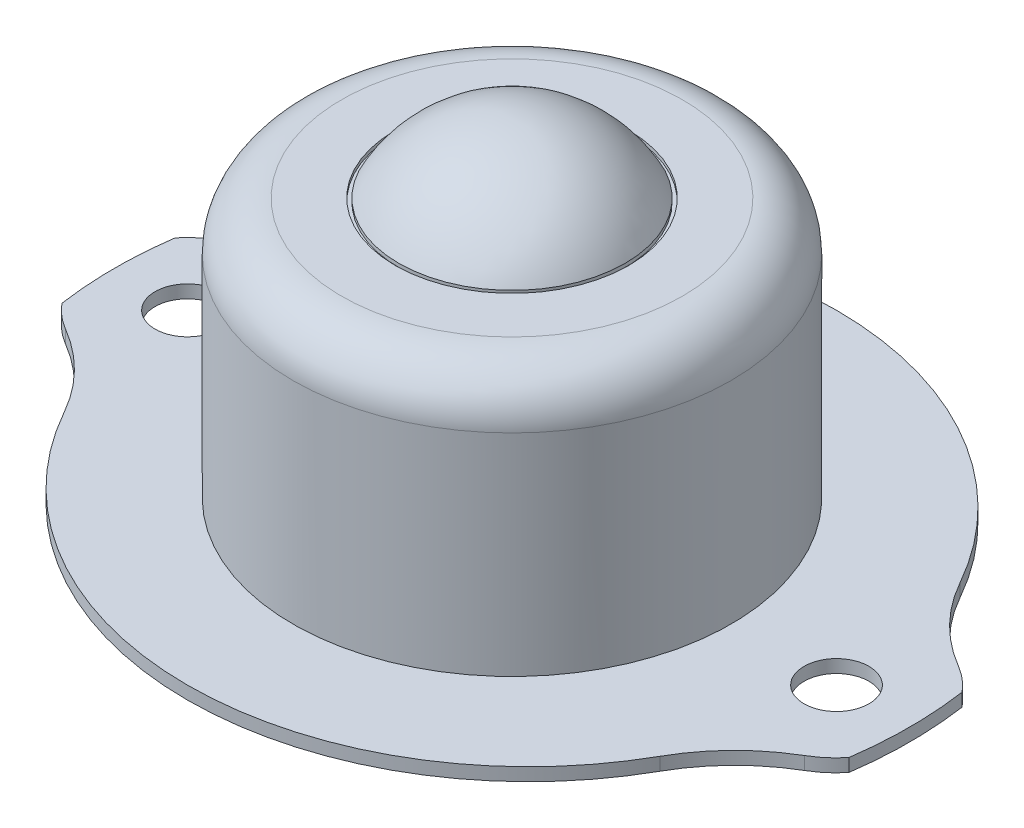
ISO-10303-21;
HEADER;
FILE_DESCRIPTION(('STEP AP214'),'2;1');
FILE_NAME('part.step','',(''),(''),'','','');
FILE_SCHEMA(('AUTOMOTIVE_DESIGN { 1 0 10303 214 1 1 1 1 }'));
ENDSEC;
DATA;
#1=APPLICATION_CONTEXT('core data for automotive mechanical design processes');
#2=APPLICATION_PROTOCOL_DEFINITION('international standard','automotive_design',2000,#1);
#3=PRODUCT_CONTEXT('',#1,'mechanical');
#4=PRODUCT('Part','Part','',(#3));
#5=PRODUCT_RELATED_PRODUCT_CATEGORY('part','',(#4));
#6=PRODUCT_DEFINITION_FORMATION('','',#4);
#7=PRODUCT_DEFINITION_CONTEXT('part definition',#1,'design');
#8=PRODUCT_DEFINITION('design','',#6,#7);
#9=PRODUCT_DEFINITION_SHAPE('','',#8);
#10=(LENGTH_UNIT() NAMED_UNIT(*) SI_UNIT(.MILLI.,.METRE.));
#11=(NAMED_UNIT(*) PLANE_ANGLE_UNIT() SI_UNIT($,.RADIAN.));
#12=(NAMED_UNIT(*) SI_UNIT($,.STERADIAN.) SOLID_ANGLE_UNIT());
#13=UNCERTAINTY_MEASURE_WITH_UNIT(LENGTH_MEASURE(1.E-05),#10,'distance_accuracy_value','');
#14=(GEOMETRIC_REPRESENTATION_CONTEXT(3) GLOBAL_UNCERTAINTY_ASSIGNED_CONTEXT((#13)) GLOBAL_UNIT_ASSIGNED_CONTEXT((#10,
#11,#12)) REPRESENTATION_CONTEXT('',''));
#15=CARTESIAN_POINT('',(0.,0.,0.));
#16=DIRECTION('',(0.,0.,1.));
#17=DIRECTION('',(1.,0.,0.));
#18=AXIS2_PLACEMENT_3D('',#15,#16,#17);
#19=CARTESIAN_POINT('',(0.,20.6,0.));
#20=DIRECTION('',(0.,1.,0.));
#21=DIRECTION('',(-1.,0.,0.));
#22=AXIS2_PLACEMENT_3D('',#19,#20,#21);
#23=CYLINDRICAL_SURFACE('',#22,24.5);
#24=CARTESIAN_POINT('',(0.,-0.400000000000001,0.));
#25=DIRECTION('',(0.,1.,0.));
#26=DIRECTION('',(-1.,0.,0.));
#27=AXIS2_PLACEMENT_3D('',#24,#25,#26);
#28=CIRCLE('',#27,24.5);
#29=CARTESIAN_POINT('',(24.25,-0.400000000000001,3.49106001094224));
#30=VERTEX_POINT('',#29);
#31=CARTESIAN_POINT('',(24.25,-0.400000000000001,-3.49106001094224));
#32=VERTEX_POINT('',#31);
#33=EDGE_CURVE('E225',#30,#32,#28,.T.);
#34=ORIENTED_EDGE('',*,*,#33,.T.);
#35=DIRECTION('',(0.,-1.,0.));
#36=VECTOR('',#35,1.);
#37=CARTESIAN_POINT('',(24.25,9.6,-3.49106001094224));
#38=LINE('',#37,#36);
#39=CARTESIAN_POINT('',(24.25,0.399999999999999,-3.49106001094224));
#40=VERTEX_POINT('',#39);
#41=EDGE_CURVE('E158',#40,#32,#38,.T.);
#42=ORIENTED_EDGE('',*,*,#41,.F.);
#43=CARTESIAN_POINT('',(0.,0.400000000000001,0.));
#44=DIRECTION('',(0.,1.,0.));
#45=DIRECTION('',(-1.,0.,0.));
#46=AXIS2_PLACEMENT_3D('',#43,#44,#45);
#47=CIRCLE('',#46,24.5);
#48=CARTESIAN_POINT('',(24.25,0.400000000000001,3.49106001094224));
#49=VERTEX_POINT('',#48);
#50=EDGE_CURVE('E229',#49,#40,#47,.T.);
#51=ORIENTED_EDGE('',*,*,#50,.F.);
#52=DIRECTION('',(0.,-1.,0.));
#53=VECTOR('',#52,1.);
#54=CARTESIAN_POINT('',(24.25,9.6,3.49106001094224));
#55=LINE('',#54,#53);
#56=EDGE_CURVE('E205',#49,#30,#55,.T.);
#57=ORIENTED_EDGE('',*,*,#56,.T.);
#58=EDGE_LOOP('',(#34,#42,#51,#57));
#59=FACE_BOUND('',#58,.T.);
#60=ADVANCED_FACE('F35',(#59),#23,.T.);
#61=CARTESIAN_POINT('',(-24.25,0.399999999999999,-3.49106001094224));
#62=VERTEX_POINT('',#61);
#63=CARTESIAN_POINT('',(-24.25,0.400000000000001,3.49106001094224));
#64=VERTEX_POINT('',#63);
#65=EDGE_CURVE('E228',#62,#64,#47,.T.);
#66=ORIENTED_EDGE('',*,*,#65,.F.);
#67=DIRECTION('',(0.,-1.,0.));
#68=VECTOR('',#67,1.);
#69=CARTESIAN_POINT('',(-24.25,9.6,-3.49106001094224));
#70=LINE('',#69,#68);
#71=CARTESIAN_POINT('',(-24.25,-0.4,-3.49106001094224));
#72=VERTEX_POINT('',#71);
#73=EDGE_CURVE('E160',#62,#72,#70,.T.);
#74=ORIENTED_EDGE('',*,*,#73,.T.);
#75=CARTESIAN_POINT('',(-24.25,-0.4,3.49106001094224));
#76=VERTEX_POINT('',#75);
#77=EDGE_CURVE('E224',#72,#76,#28,.T.);
#78=ORIENTED_EDGE('',*,*,#77,.T.);
#79=DIRECTION('',(0.,-1.,0.));
#80=VECTOR('',#79,1.);
#81=CARTESIAN_POINT('',(-24.25,9.6,3.49106001094224));
#82=LINE('',#81,#80);
#83=EDGE_CURVE('E202',#64,#76,#82,.T.);
#84=ORIENTED_EDGE('',*,*,#83,.F.);
#85=EDGE_LOOP('',(#66,#74,#78,#84));
#86=FACE_BOUND('',#85,.T.);
#87=ADVANCED_FACE('F267',(#86),#23,.T.);
#88=CARTESIAN_POINT('',(0.,0.399999999999999,0.));
#89=DIRECTION('',(0.,-1.,0.));
#90=DIRECTION('',(1.,0.,0.));
#91=AXIS2_PLACEMENT_3D('',#88,#89,#90);
#92=PLANE('',#91);
#93=CARTESIAN_POINT('',(0.,0.400000000000001,0.));
#94=DIRECTION('',(0.,1.,0.));
#95=DIRECTION('',(-1.,0.,0.));
#96=AXIS2_PLACEMENT_3D('',#93,#94,#95);
#97=CIRCLE('',#96,13.5);
#98=CARTESIAN_POINT('',(-13.5,0.400000000000001,0.));
#99=VERTEX_POINT('',#98);
#100=EDGE_CURVE('E232',#99,#99,#97,.T.);
#101=ORIENTED_EDGE('',*,*,#100,.F.);
#102=EDGE_LOOP('',(#101));
#103=FACE_BOUND('',#102,.T.);
#104=CARTESIAN_POINT('',(20.,0.399999999999999,0.));
#105=DIRECTION('',(0.,-1.,0.));
#106=DIRECTION('',(1.,0.,0.));
#107=AXIS2_PLACEMENT_3D('',#104,#105,#106);
#108=CIRCLE('',#107,2.);
#109=CARTESIAN_POINT('',(22.,0.399999999999999,0.));
#110=VERTEX_POINT('',#109);
#111=EDGE_CURVE('E157',#110,#110,#108,.T.);
#112=ORIENTED_EDGE('',*,*,#111,.T.);
#113=EDGE_LOOP('',(#112));
#114=FACE_BOUND('',#113,.T.);
#115=CARTESIAN_POINT('',(-20.,0.399999999999999,0.));
#116=DIRECTION('',(0.,-1.,0.));
#117=DIRECTION('',(1.,0.,0.));
#118=AXIS2_PLACEMENT_3D('',#115,#116,#117);
#119=CIRCLE('',#118,2.);
#120=CARTESIAN_POINT('',(-18.,0.399999999999999,0.));
#121=VERTEX_POINT('',#120);
#122=EDGE_CURVE('E173',#121,#121,#119,.T.);
#123=ORIENTED_EDGE('',*,*,#122,.T.);
#124=EDGE_LOOP('',(#123));
#125=FACE_BOUND('',#124,.T.);
#126=CARTESIAN_POINT('',(20.,0.399999999999999,0.));
#127=DIRECTION('',(0.,-1.,0.));
#128=DIRECTION('',(1.,0.,0.));
#129=AXIS2_PLACEMENT_3D('',#126,#127,#128);
#130=CIRCLE('',#129,5.5);
#131=CARTESIAN_POINT('',(22.7743757898246,0.399999999999999,-4.74898294130805));
#132=VERTEX_POINT('',#131);
#133=EDGE_CURVE('E181',#132,#40,#130,.T.);
#134=ORIENTED_EDGE('',*,*,#133,.F.);
#135=CARTESIAN_POINT('',(28.8275593312602,0.399999999999999,-15.1104002677983));
#136=DIRECTION('',(0.,-1.,0.));
#137=DIRECTION('',(1.,0.,0.));
#138=AXIS2_PLACEMENT_3D('',#135,#136,#137);
#139=CIRCLE('',#138,12.);
#140=CARTESIAN_POINT('',(18.3575041136549,0.399999999999999,-9.24712953037754));
#141=VERTEX_POINT('',#140);
#142=EDGE_CURVE('E183',#141,#132,#139,.F.);
#143=ORIENTED_EDGE('',*,*,#142,.F.);
#144=CARTESIAN_POINT('',(0.,0.399999999999999,1.03314258324869));
#145=DIRECTION('',(0.,-1.,0.));
#146=DIRECTION('',(1.,0.,0.));
#147=AXIS2_PLACEMENT_3D('',#144,#145,#146);
#148=CIRCLE('',#147,21.0400083653276);
#149=CARTESIAN_POINT('',(-18.3575041136549,0.399999999999999,-9.24712953037753));
#150=VERTEX_POINT('',#149);
#151=EDGE_CURVE('E176',#150,#141,#148,.T.);
#152=ORIENTED_EDGE('',*,*,#151,.F.);
#153=CARTESIAN_POINT('',(-28.8275593312602,0.399999999999999,-15.1104002677983));
#154=DIRECTION('',(0.,-1.,0.));
#155=DIRECTION('',(1.,0.,0.));
#156=AXIS2_PLACEMENT_3D('',#153,#154,#155);
#157=CIRCLE('',#156,12.);
#158=CARTESIAN_POINT('',(-22.7743757898246,0.399999999999999,-4.74898294130805));
#159=VERTEX_POINT('',#158);
#160=EDGE_CURVE('E134',#150,#159,#157,.T.);
#161=ORIENTED_EDGE('',*,*,#160,.T.);
#162=CARTESIAN_POINT('',(-20.,0.399999999999999,0.));
#163=DIRECTION('',(0.,-1.,0.));
#164=DIRECTION('',(1.,0.,0.));
#165=AXIS2_PLACEMENT_3D('',#162,#163,#164);
#166=CIRCLE('',#165,5.5);
#167=EDGE_CURVE('E179',#62,#159,#166,.T.);
#168=ORIENTED_EDGE('',*,*,#167,.F.);
#169=ORIENTED_EDGE('',*,*,#65,.T.);
#170=CARTESIAN_POINT('',(-20.,0.399999999999999,0.));
#171=DIRECTION('',(0.,-1.,0.));
#172=DIRECTION('',(1.,0.,0.));
#173=AXIS2_PLACEMENT_3D('',#170,#171,#172);
#174=CIRCLE('',#173,5.5);
#175=CARTESIAN_POINT('',(-22.7743757898246,0.399999999999999,4.74898294130805));
#176=VERTEX_POINT('',#175);
#177=EDGE_CURVE('E219',#176,#64,#174,.T.);
#178=ORIENTED_EDGE('',*,*,#177,.F.);
#179=CARTESIAN_POINT('',(-28.8275593312602,0.399999999999999,15.1104002677983));
#180=DIRECTION('',(0.,-1.,0.));
#181=DIRECTION('',(1.,0.,0.));
#182=AXIS2_PLACEMENT_3D('',#179,#180,#181);
#183=CIRCLE('',#182,12.);
#184=CARTESIAN_POINT('',(-18.3575041136549,0.399999999999999,9.24712953037753));
#185=VERTEX_POINT('',#184);
#186=EDGE_CURVE('E222',#185,#176,#183,.F.);
#187=ORIENTED_EDGE('',*,*,#186,.F.);
#188=CARTESIAN_POINT('',(0.,0.399999999999999,-1.03314258324869));
#189=DIRECTION('',(0.,-1.,0.));
#190=DIRECTION('',(1.,0.,0.));
#191=AXIS2_PLACEMENT_3D('',#188,#189,#190);
#192=CIRCLE('',#191,21.0400083653276);
#193=CARTESIAN_POINT('',(18.3575041136549,0.399999999999999,9.24712953037753));
#194=VERTEX_POINT('',#193);
#195=EDGE_CURVE('E201',#185,#194,#192,.F.);
#196=ORIENTED_EDGE('',*,*,#195,.T.);
#197=CARTESIAN_POINT('',(28.8275593312602,0.399999999999999,15.1104002677983));
#198=DIRECTION('',(0.,-1.,0.));
#199=DIRECTION('',(1.,0.,0.));
#200=AXIS2_PLACEMENT_3D('',#197,#198,#199);
#201=CIRCLE('',#200,12.);
#202=CARTESIAN_POINT('',(22.7743757898246,0.399999999999999,4.74898294130805));
#203=VERTEX_POINT('',#202);
#204=EDGE_CURVE('E215',#203,#194,#201,.F.);
#205=ORIENTED_EDGE('',*,*,#204,.F.);
#206=CARTESIAN_POINT('',(20.,0.399999999999999,0.));
#207=DIRECTION('',(0.,-1.,0.));
#208=DIRECTION('',(1.,0.,0.));
#209=AXIS2_PLACEMENT_3D('',#206,#207,#208);
#210=CIRCLE('',#209,5.5);
#211=EDGE_CURVE('E217',#49,#203,#210,.T.);
#212=ORIENTED_EDGE('',*,*,#211,.F.);
#213=ORIENTED_EDGE('',*,*,#50,.T.);
#214=EDGE_LOOP('',(#134,#143,#152,#161,#168,#169,#178,#187,#196,#205,#212,#213));
#215=FACE_BOUND('',#214,.T.);
#216=ADVANCED_FACE('F273',(#103,#114,#125,#215),#92,.F.);
#217=CARTESIAN_POINT('',(0.,-0.4,0.));
#218=DIRECTION('',(0.,-1.,0.));
#219=DIRECTION('',(1.,0.,0.));
#220=AXIS2_PLACEMENT_3D('',#217,#218,#219);
#221=PLANE('',#220);
#222=CARTESIAN_POINT('',(-20.,-0.4,0.));
#223=DIRECTION('',(0.,-1.,0.));
#224=DIRECTION('',(1.,0.,0.));
#225=AXIS2_PLACEMENT_3D('',#222,#223,#224);
#226=CIRCLE('',#225,2.);
#227=CARTESIAN_POINT('',(-18.,-0.4,0.));
#228=VERTEX_POINT('',#227);
#229=EDGE_CURVE('E165',#228,#228,#226,.T.);
#230=ORIENTED_EDGE('',*,*,#229,.F.);
#231=EDGE_LOOP('',(#230));
#232=FACE_BOUND('',#231,.T.);
#233=CARTESIAN_POINT('',(20.,-0.400000000000001,0.));
#234=DIRECTION('',(0.,-1.,0.));
#235=DIRECTION('',(1.,0.,0.));
#236=AXIS2_PLACEMENT_3D('',#233,#234,#235);
#237=CIRCLE('',#236,2.);
#238=CARTESIAN_POINT('',(22.,-0.400000000000001,0.));
#239=VERTEX_POINT('',#238);
#240=EDGE_CURVE('E168',#239,#239,#237,.T.);
#241=ORIENTED_EDGE('',*,*,#240,.F.);
#242=EDGE_LOOP('',(#241));
#243=FACE_BOUND('',#242,.T.);
#244=CARTESIAN_POINT('',(28.8275593312602,-0.400000000000001,-15.1104002677983));
#245=DIRECTION('',(0.,-1.,0.));
#246=DIRECTION('',(1.,0.,0.));
#247=AXIS2_PLACEMENT_3D('',#244,#245,#246);
#248=CIRCLE('',#247,12.);
#249=CARTESIAN_POINT('',(18.3575041136549,-0.400000000000001,-9.24712953037754));
#250=VERTEX_POINT('',#249);
#251=CARTESIAN_POINT('',(22.7743757898246,-0.400000000000001,-4.74898294130805));
#252=VERTEX_POINT('',#251);
#253=EDGE_CURVE('E50',#250,#252,#248,.F.);
#254=ORIENTED_EDGE('',*,*,#253,.T.);
#255=CARTESIAN_POINT('',(20.,-0.400000000000001,0.));
#256=DIRECTION('',(0.,-1.,0.));
#257=DIRECTION('',(1.,0.,0.));
#258=AXIS2_PLACEMENT_3D('',#255,#256,#257);
#259=CIRCLE('',#258,5.5);
#260=EDGE_CURVE('E149',#252,#32,#259,.T.);
#261=ORIENTED_EDGE('',*,*,#260,.T.);
#262=ORIENTED_EDGE('',*,*,#33,.F.);
#263=CARTESIAN_POINT('',(20.,-0.400000000000001,0.));
#264=DIRECTION('',(0.,-1.,0.));
#265=DIRECTION('',(1.,0.,0.));
#266=AXIS2_PLACEMENT_3D('',#263,#264,#265);
#267=CIRCLE('',#266,5.5);
#268=CARTESIAN_POINT('',(22.7743757898246,-0.400000000000001,4.74898294130805));
#269=VERTEX_POINT('',#268);
#270=EDGE_CURVE('E192',#30,#269,#267,.T.);
#271=ORIENTED_EDGE('',*,*,#270,.T.);
#272=CARTESIAN_POINT('',(28.8275593312602,-0.400000000000001,15.1104002677983));
#273=DIRECTION('',(0.,-1.,0.));
#274=DIRECTION('',(1.,0.,0.));
#275=AXIS2_PLACEMENT_3D('',#272,#273,#274);
#276=CIRCLE('',#275,12.);
#277=CARTESIAN_POINT('',(18.3575041136549,-0.400000000000001,9.24712953037753));
#278=VERTEX_POINT('',#277);
#279=EDGE_CURVE('E189',#269,#278,#276,.F.);
#280=ORIENTED_EDGE('',*,*,#279,.T.);
#281=CARTESIAN_POINT('',(0.,-0.4,-1.03314258324869));
#282=DIRECTION('',(0.,-1.,0.));
#283=DIRECTION('',(1.,0.,0.));
#284=AXIS2_PLACEMENT_3D('',#281,#282,#283);
#285=CIRCLE('',#284,21.0400083653276);
#286=CARTESIAN_POINT('',(-18.3575041136549,-0.400000000000001,9.24712953037753));
#287=VERTEX_POINT('',#286);
#288=EDGE_CURVE('E186',#287,#278,#285,.F.);
#289=ORIENTED_EDGE('',*,*,#288,.F.);
#290=CARTESIAN_POINT('',(-28.8275593312602,-0.4,15.1104002677983));
#291=DIRECTION('',(0.,-1.,0.));
#292=DIRECTION('',(1.,0.,0.));
#293=AXIS2_PLACEMENT_3D('',#290,#291,#292);
#294=CIRCLE('',#293,12.);
#295=CARTESIAN_POINT('',(-22.7743757898246,-0.4,4.74898294130805));
#296=VERTEX_POINT('',#295);
#297=EDGE_CURVE('E58',#287,#296,#294,.F.);
#298=ORIENTED_EDGE('',*,*,#297,.T.);
#299=CARTESIAN_POINT('',(-20.,-0.4,0.));
#300=DIRECTION('',(0.,-1.,0.));
#301=DIRECTION('',(1.,0.,0.));
#302=AXIS2_PLACEMENT_3D('',#299,#300,#301);
#303=CIRCLE('',#302,5.5);
#304=EDGE_CURVE('E195',#296,#76,#303,.T.);
#305=ORIENTED_EDGE('',*,*,#304,.T.);
#306=ORIENTED_EDGE('',*,*,#77,.F.);
#307=CARTESIAN_POINT('',(-20.,-0.4,0.));
#308=DIRECTION('',(0.,-1.,0.));
#309=DIRECTION('',(1.,0.,0.));
#310=AXIS2_PLACEMENT_3D('',#307,#308,#309);
#311=CIRCLE('',#310,5.5);
#312=CARTESIAN_POINT('',(-22.7743757898246,-0.4,-4.74898294130805));
#313=VERTEX_POINT('',#312);
#314=EDGE_CURVE('E147',#72,#313,#311,.T.);
#315=ORIENTED_EDGE('',*,*,#314,.T.);
#316=CARTESIAN_POINT('',(-28.8275593312602,-0.4,-15.1104002677983));
#317=DIRECTION('',(0.,-1.,0.));
#318=DIRECTION('',(1.,0.,0.));
#319=AXIS2_PLACEMENT_3D('',#316,#317,#318);
#320=CIRCLE('',#319,12.);
#321=CARTESIAN_POINT('',(-18.3575041136549,-0.4,-9.24712953037753));
#322=VERTEX_POINT('',#321);
#323=EDGE_CURVE('E131',#322,#313,#320,.T.);
#324=ORIENTED_EDGE('',*,*,#323,.F.);
#325=CARTESIAN_POINT('',(0.,-0.4,1.03314258324869));
#326=DIRECTION('',(0.,-1.,0.));
#327=DIRECTION('',(1.,0.,0.));
#328=AXIS2_PLACEMENT_3D('',#325,#326,#327);
#329=CIRCLE('',#328,21.0400083653276);
#330=EDGE_CURVE('E141',#322,#250,#329,.T.);
#331=ORIENTED_EDGE('',*,*,#330,.T.);
#332=EDGE_LOOP('',(#254,#261,#262,#271,#280,#289,#298,#305,#306,#315,#324,#331));
#333=FACE_BOUND('',#332,.T.);
#334=ADVANCED_FACE('F145',(#232,#243,#333),#221,.T.);
#335=CARTESIAN_POINT('',(0.,20.6,0.));
#336=DIRECTION('',(0.,1.,0.));
#337=DIRECTION('',(-1.,0.,0.));
#338=AXIS2_PLACEMENT_3D('',#335,#336,#337);
#339=CYLINDRICAL_SURFACE('',#338,6.97997134664606);
#340=CARTESIAN_POINT('',(0.,16.1776811969494,0.));
#341=DIRECTION('',(0.,1.,0.));
#342=DIRECTION('',(-1.,0.,0.));
#343=AXIS2_PLACEMENT_3D('',#340,#341,#342);
#344=CIRCLE('',#343,6.97997134664606);
#345=CARTESIAN_POINT('',(-6.97997134664606,16.1776811969494,0.));
#346=VERTEX_POINT('',#345);
#347=EDGE_CURVE('E241',#346,#346,#344,.T.);
#348=ORIENTED_EDGE('',*,*,#347,.T.);
#349=EDGE_LOOP('',(#348));
#350=FACE_BOUND('',#349,.T.);
#351=CARTESIAN_POINT('',(0.,16.4,0.));
#352=DIRECTION('',(0.,1.,0.));
#353=DIRECTION('',(-1.,0.,0.));
#354=AXIS2_PLACEMENT_3D('',#351,#352,#353);
#355=CIRCLE('',#354,6.97997134664606);
#356=CARTESIAN_POINT('',(-6.97997134664606,16.4,0.));
#357=VERTEX_POINT('',#356);
#358=EDGE_CURVE('E244',#357,#357,#355,.T.);
#359=ORIENTED_EDGE('',*,*,#358,.F.);
#360=EDGE_LOOP('',(#359));
#361=FACE_BOUND('',#360,.T.);
#362=ADVANCED_FACE('F291',(#350,#361),#339,.T.);
#363=CARTESIAN_POINT('',(0.,16.1776811969494,0.));
#364=DIRECTION('',(0.,-1.,0.));
#365=DIRECTION('',(1.,0.,0.));
#366=AXIS2_PLACEMENT_3D('',#363,#364,#365);
#367=PLANE('',#366);
#368=ORIENTED_EDGE('',*,*,#347,.F.);
#369=EDGE_LOOP('',(#368));
#370=FACE_BOUND('',#369,.T.);
#371=CARTESIAN_POINT('',(0.,16.1776811969494,0.));
#372=DIRECTION('',(0.,1.,0.));
#373=DIRECTION('',(-1.,0.,0.));
#374=AXIS2_PLACEMENT_3D('',#371,#372,#373);
#375=CIRCLE('',#374,7.20555341386073);
#376=CARTESIAN_POINT('',(-7.20555341386073,16.1776811969494,0.));
#377=VERTEX_POINT('',#376);
#378=EDGE_CURVE('E238',#377,#377,#375,.T.);
#379=ORIENTED_EDGE('',*,*,#378,.T.);
#380=EDGE_LOOP('',(#379));
#381=FACE_BOUND('',#380,.T.);
#382=ADVANCED_FACE('F288',(#370,#381),#367,.F.);
#383=CARTESIAN_POINT('',(0.,20.6,0.));
#384=DIRECTION('',(0.,1.,0.));
#385=DIRECTION('',(-1.,0.,0.));
#386=AXIS2_PLACEMENT_3D('',#383,#384,#385);
#387=CYLINDRICAL_SURFACE('',#386,7.20555341386073);
#388=ORIENTED_EDGE('',*,*,#378,.F.);
#389=EDGE_LOOP('',(#388));
#390=FACE_BOUND('',#389,.T.);
#391=CARTESIAN_POINT('',(0.,16.4,0.));
#392=DIRECTION('',(0.,1.,0.));
#393=DIRECTION('',(-1.,0.,0.));
#394=AXIS2_PLACEMENT_3D('',#391,#392,#393);
#395=CIRCLE('',#394,7.20555341386073);
#396=CARTESIAN_POINT('',(-7.20555341386073,16.4,0.));
#397=VERTEX_POINT('',#396);
#398=EDGE_CURVE('E235',#397,#397,#395,.T.);
#399=ORIENTED_EDGE('',*,*,#398,.T.);
#400=EDGE_LOOP('',(#399));
#401=FACE_BOUND('',#400,.T.);
#402=ADVANCED_FACE('F285',(#390,#401),#387,.F.);
#403=CARTESIAN_POINT('',(0.,16.4,0.));
#404=DIRECTION('',(0.,-1.,0.));
#405=DIRECTION('',(1.,0.,0.));
#406=AXIS2_PLACEMENT_3D('',#403,#404,#405);
#407=PLANE('',#406);
#408=CARTESIAN_POINT('',(0.,16.4,0.));
#409=DIRECTION('',(0.,-1.,0.));
#410=DIRECTION('',(1.,0.,0.));
#411=AXIS2_PLACEMENT_3D('',#408,#409,#410);
#412=CIRCLE('',#411,10.5);
#413=CARTESIAN_POINT('',(10.5,16.4,0.));
#414=VERTEX_POINT('',#413);
#415=EDGE_CURVE('E43',#414,#414,#412,.F.);
#416=ORIENTED_EDGE('',*,*,#415,.T.);
#417=EDGE_LOOP('',(#416));
#418=FACE_BOUND('',#417,.T.);
#419=ORIENTED_EDGE('',*,*,#398,.F.);
#420=EDGE_LOOP('',(#419));
#421=FACE_BOUND('',#420,.T.);
#422=ADVANCED_FACE('F249',(#418,#421),#407,.F.);
#423=CARTESIAN_POINT('',(0.,20.6,0.));
#424=DIRECTION('',(0.,1.,0.));
#425=DIRECTION('',(-1.,0.,0.));
#426=AXIS2_PLACEMENT_3D('',#423,#424,#425);
#427=CYLINDRICAL_SURFACE('',#426,13.5);
#428=CARTESIAN_POINT('',(0.,13.4,0.));
#429=DIRECTION('',(0.,-1.,0.));
#430=DIRECTION('',(1.,0.,0.));
#431=AXIS2_PLACEMENT_3D('',#428,#429,#430);
#432=CIRCLE('',#431,13.5);
#433=CARTESIAN_POINT('',(13.5,13.4,0.));
#434=VERTEX_POINT('',#433);
#435=EDGE_CURVE('E11',#434,#434,#432,.T.);
#436=ORIENTED_EDGE('',*,*,#435,.T.);
#437=EDGE_LOOP('',(#436));
#438=FACE_BOUND('',#437,.T.);
#439=ORIENTED_EDGE('',*,*,#100,.T.);
#440=EDGE_LOOP('',(#439));
#441=FACE_BOUND('',#440,.T.);
#442=ADVANCED_FACE('F262',(#438,#441),#427,.T.);
#443=CARTESIAN_POINT('',(0.,12.7,0.));
#444=DIRECTION('',(0.,1.,0.));
#445=DIRECTION('',(1.,0.,0.));
#446=AXIS2_PLACEMENT_3D('',#443,#444,#445);
#447=SPHERICAL_SURFACE('',#446,7.9);
#448=ORIENTED_EDGE('',*,*,#358,.T.);
#449=EDGE_LOOP('',(#448));
#450=FACE_BOUND('',#449,.T.);
#451=ADVANCED_FACE('F254',(#450),#447,.T.);
#452=CARTESIAN_POINT('',(0.,13.4,0.));
#453=DIRECTION('',(0.,-1.,0.));
#454=DIRECTION('',(1.,0.,0.));
#455=AXIS2_PLACEMENT_3D('',#452,#453,#454);
#456=TOROIDAL_SURFACE('',#455,10.5,3.);
#457=ORIENTED_EDGE('',*,*,#435,.F.);
#458=EDGE_LOOP('',(#457));
#459=FACE_BOUND('',#458,.T.);
#460=ORIENTED_EDGE('',*,*,#415,.F.);
#461=EDGE_LOOP('',(#460));
#462=FACE_BOUND('',#461,.T.);
#463=ADVANCED_FACE('F37',(#459,#462),#456,.T.);
#464=CARTESIAN_POINT('',(-28.8275593312602,9.6,15.1104002677983));
#465=DIRECTION('',(0.,-1.,0.));
#466=DIRECTION('',(1.,0.,0.));
#467=AXIS2_PLACEMENT_3D('',#464,#465,#466);
#468=CYLINDRICAL_SURFACE('',#467,12.);
#469=ORIENTED_EDGE('',*,*,#186,.T.);
#470=DIRECTION('',(0.,-1.,0.));
#471=VECTOR('',#470,1.);
#472=CARTESIAN_POINT('',(-22.7743757898246,9.6,4.74898294130805));
#473=LINE('',#472,#471);
#474=EDGE_CURVE('E199',#176,#296,#473,.T.);
#475=ORIENTED_EDGE('',*,*,#474,.T.);
#476=ORIENTED_EDGE('',*,*,#297,.F.);
#477=DIRECTION('',(0.,-1.,0.));
#478=VECTOR('',#477,1.);
#479=CARTESIAN_POINT('',(-18.3575041136549,9.6,9.24712953037753));
#480=LINE('',#479,#478);
#481=EDGE_CURVE('E198',#185,#287,#480,.T.);
#482=ORIENTED_EDGE('',*,*,#481,.F.);
#483=EDGE_LOOP('',(#469,#475,#476,#482));
#484=FACE_BOUND('',#483,.T.);
#485=ADVANCED_FACE('F253',(#484),#468,.F.);
#486=CARTESIAN_POINT('',(-20.,9.6,0.));
#487=DIRECTION('',(0.,-1.,0.));
#488=DIRECTION('',(1.,0.,0.));
#489=AXIS2_PLACEMENT_3D('',#486,#487,#488);
#490=CYLINDRICAL_SURFACE('',#489,5.5);
#491=ORIENTED_EDGE('',*,*,#177,.T.);
#492=ORIENTED_EDGE('',*,*,#83,.T.);
#493=ORIENTED_EDGE('',*,*,#304,.F.);
#494=ORIENTED_EDGE('',*,*,#474,.F.);
#495=EDGE_LOOP('',(#491,#492,#493,#494));
#496=FACE_BOUND('',#495,.T.);
#497=ADVANCED_FACE('F260',(#496),#490,.T.);
#498=CARTESIAN_POINT('',(20.,9.6,0.));
#499=DIRECTION('',(0.,-1.,0.));
#500=DIRECTION('',(1.,0.,0.));
#501=AXIS2_PLACEMENT_3D('',#498,#499,#500);
#502=CYLINDRICAL_SURFACE('',#501,5.5);
#503=ORIENTED_EDGE('',*,*,#211,.T.);
#504=DIRECTION('',(0.,-1.,0.));
#505=VECTOR('',#504,1.);
#506=CARTESIAN_POINT('',(22.7743757898246,9.6,4.74898294130805));
#507=LINE('',#506,#505);
#508=EDGE_CURVE('E208',#203,#269,#507,.T.);
#509=ORIENTED_EDGE('',*,*,#508,.T.);
#510=ORIENTED_EDGE('',*,*,#270,.F.);
#511=ORIENTED_EDGE('',*,*,#56,.F.);
#512=EDGE_LOOP('',(#503,#509,#510,#511));
#513=FACE_BOUND('',#512,.T.);
#514=ADVANCED_FACE('F336',(#513),#502,.T.);
#515=CARTESIAN_POINT('',(28.8275593312602,9.6,15.1104002677983));
#516=DIRECTION('',(0.,-1.,0.));
#517=DIRECTION('',(1.,0.,0.));
#518=AXIS2_PLACEMENT_3D('',#515,#516,#517);
#519=CYLINDRICAL_SURFACE('',#518,12.);
#520=ORIENTED_EDGE('',*,*,#204,.T.);
#521=DIRECTION('',(0.,-1.,0.));
#522=VECTOR('',#521,1.);
#523=CARTESIAN_POINT('',(18.3575041136549,9.6,9.24712953037753));
#524=LINE('',#523,#522);
#525=EDGE_CURVE('E210',#194,#278,#524,.T.);
#526=ORIENTED_EDGE('',*,*,#525,.T.);
#527=ORIENTED_EDGE('',*,*,#279,.F.);
#528=ORIENTED_EDGE('',*,*,#508,.F.);
#529=EDGE_LOOP('',(#520,#526,#527,#528));
#530=FACE_BOUND('',#529,.T.);
#531=ADVANCED_FACE('F340',(#530),#519,.F.);
#532=CARTESIAN_POINT('',(0.,9.6,-1.03314258324869));
#533=DIRECTION('',(0.,-1.,0.));
#534=DIRECTION('',(1.,0.,0.));
#535=AXIS2_PLACEMENT_3D('',#532,#533,#534);
#536=CYLINDRICAL_SURFACE('',#535,21.0400083653276);
#537=ORIENTED_EDGE('',*,*,#481,.T.);
#538=ORIENTED_EDGE('',*,*,#288,.T.);
#539=ORIENTED_EDGE('',*,*,#525,.F.);
#540=ORIENTED_EDGE('',*,*,#195,.F.);
#541=EDGE_LOOP('',(#537,#538,#539,#540));
#542=FACE_BOUND('',#541,.T.);
#543=ADVANCED_FACE('F316',(#542),#536,.T.);
#544=CARTESIAN_POINT('',(20.,9.6,0.));
#545=DIRECTION('',(0.,-1.,0.));
#546=DIRECTION('',(1.,0.,0.));
#547=AXIS2_PLACEMENT_3D('',#544,#545,#546);
#548=CYLINDRICAL_SURFACE('',#547,2.);
#549=ORIENTED_EDGE('',*,*,#240,.T.);
#550=EDGE_LOOP('',(#549));
#551=FACE_BOUND('',#550,.T.);
#552=ORIENTED_EDGE('',*,*,#111,.F.);
#553=EDGE_LOOP('',(#552));
#554=FACE_BOUND('',#553,.T.);
#555=ADVANCED_FACE('F312',(#551,#554),#548,.F.);
#556=CARTESIAN_POINT('',(-20.,9.6,0.));
#557=DIRECTION('',(0.,-1.,0.));
#558=DIRECTION('',(1.,0.,0.));
#559=AXIS2_PLACEMENT_3D('',#556,#557,#558);
#560=CYLINDRICAL_SURFACE('',#559,2.);
#561=ORIENTED_EDGE('',*,*,#229,.T.);
#562=EDGE_LOOP('',(#561));
#563=FACE_BOUND('',#562,.T.);
#564=ORIENTED_EDGE('',*,*,#122,.F.);
#565=EDGE_LOOP('',(#564));
#566=FACE_BOUND('',#565,.T.);
#567=ADVANCED_FACE('F315',(#563,#566),#560,.F.);
#568=CARTESIAN_POINT('',(28.8275593312602,9.6,-15.1104002677983));
#569=DIRECTION('',(0.,-1.,0.));
#570=DIRECTION('',(1.,0.,0.));
#571=AXIS2_PLACEMENT_3D('',#568,#569,#570);
#572=CYLINDRICAL_SURFACE('',#571,12.);
#573=ORIENTED_EDGE('',*,*,#142,.T.);
#574=DIRECTION('',(0.,-1.,0.));
#575=VECTOR('',#574,1.);
#576=CARTESIAN_POINT('',(22.7743757898246,9.6,-4.74898294130805));
#577=LINE('',#576,#575);
#578=EDGE_CURVE('E155',#132,#252,#577,.T.);
#579=ORIENTED_EDGE('',*,*,#578,.T.);
#580=ORIENTED_EDGE('',*,*,#253,.F.);
#581=DIRECTION('',(0.,-1.,0.));
#582=VECTOR('',#581,1.);
#583=CARTESIAN_POINT('',(18.3575041136549,9.6,-9.24712953037754));
#584=LINE('',#583,#582);
#585=EDGE_CURVE('E138',#141,#250,#584,.T.);
#586=ORIENTED_EDGE('',*,*,#585,.F.);
#587=EDGE_LOOP('',(#573,#579,#580,#586));
#588=FACE_BOUND('',#587,.T.);
#589=ADVANCED_FACE('F352',(#588),#572,.F.);
#590=CARTESIAN_POINT('',(20.,9.6,0.));
#591=DIRECTION('',(0.,-1.,0.));
#592=DIRECTION('',(1.,0.,0.));
#593=AXIS2_PLACEMENT_3D('',#590,#591,#592);
#594=CYLINDRICAL_SURFACE('',#593,5.5);
#595=ORIENTED_EDGE('',*,*,#133,.T.);
#596=ORIENTED_EDGE('',*,*,#41,.T.);
#597=ORIENTED_EDGE('',*,*,#260,.F.);
#598=ORIENTED_EDGE('',*,*,#578,.F.);
#599=EDGE_LOOP('',(#595,#596,#597,#598));
#600=FACE_BOUND('',#599,.T.);
#601=ADVANCED_FACE('F330',(#600),#594,.T.);
#602=CARTESIAN_POINT('',(-20.,9.6,0.));
#603=DIRECTION('',(0.,-1.,0.));
#604=DIRECTION('',(1.,0.,0.));
#605=AXIS2_PLACEMENT_3D('',#602,#603,#604);
#606=CYLINDRICAL_SURFACE('',#605,5.5);
#607=ORIENTED_EDGE('',*,*,#167,.T.);
#608=DIRECTION('',(0.,-1.,0.));
#609=VECTOR('',#608,1.);
#610=CARTESIAN_POINT('',(-22.7743757898246,9.6,-4.74898294130805));
#611=LINE('',#610,#609);
#612=EDGE_CURVE('E137',#159,#313,#611,.T.);
#613=ORIENTED_EDGE('',*,*,#612,.T.);
#614=ORIENTED_EDGE('',*,*,#314,.F.);
#615=ORIENTED_EDGE('',*,*,#73,.F.);
#616=EDGE_LOOP('',(#607,#613,#614,#615));
#617=FACE_BOUND('',#616,.T.);
#618=ADVANCED_FACE('F351',(#617),#606,.T.);
#619=CARTESIAN_POINT('',(-28.8275593312602,9.6,-15.1104002677983));
#620=DIRECTION('',(0.,-1.,0.));
#621=DIRECTION('',(1.,0.,0.));
#622=AXIS2_PLACEMENT_3D('',#619,#620,#621);
#623=CYLINDRICAL_SURFACE('',#622,12.);
#624=DIRECTION('',(0.,-1.,0.));
#625=VECTOR('',#624,1.);
#626=CARTESIAN_POINT('',(-18.3575041136549,9.6,-9.24712953037753));
#627=LINE('',#626,#625);
#628=EDGE_CURVE('E126',#150,#322,#627,.T.);
#629=ORIENTED_EDGE('',*,*,#628,.T.);
#630=ORIENTED_EDGE('',*,*,#323,.T.);
#631=ORIENTED_EDGE('',*,*,#612,.F.);
#632=ORIENTED_EDGE('',*,*,#160,.F.);
#633=EDGE_LOOP('',(#629,#630,#631,#632));
#634=FACE_BOUND('',#633,.T.);
#635=ADVANCED_FACE('F128',(#634),#623,.F.);
#636=CARTESIAN_POINT('',(0.,9.6,1.03314258324869));
#637=DIRECTION('',(0.,-1.,0.));
#638=DIRECTION('',(1.,0.,0.));
#639=AXIS2_PLACEMENT_3D('',#636,#637,#638);
#640=CYLINDRICAL_SURFACE('',#639,21.0400083653276);
#641=ORIENTED_EDGE('',*,*,#151,.T.);
#642=ORIENTED_EDGE('',*,*,#585,.T.);
#643=ORIENTED_EDGE('',*,*,#330,.F.);
#644=ORIENTED_EDGE('',*,*,#628,.F.);
#645=EDGE_LOOP('',(#641,#642,#643,#644));
#646=FACE_BOUND('',#645,.T.);
#647=ADVANCED_FACE('F142',(#646),#640,.T.);
#648=CLOSED_SHELL('',(#60,#87,#216,#334,#362,#382,#402,#422,#442,#451,#463,#485,#497,#514,#531,
#543,#555,#567,#589,#601,#618,#635,#647));
#649=MANIFOLD_SOLID_BREP('B2',#648);
#650=ADVANCED_BREP_SHAPE_REPRESENTATION('',(#18,#649),#14);
#651=SHAPE_DEFINITION_REPRESENTATION(#9,#650);
ENDSEC;
END-ISO-10303-21;
